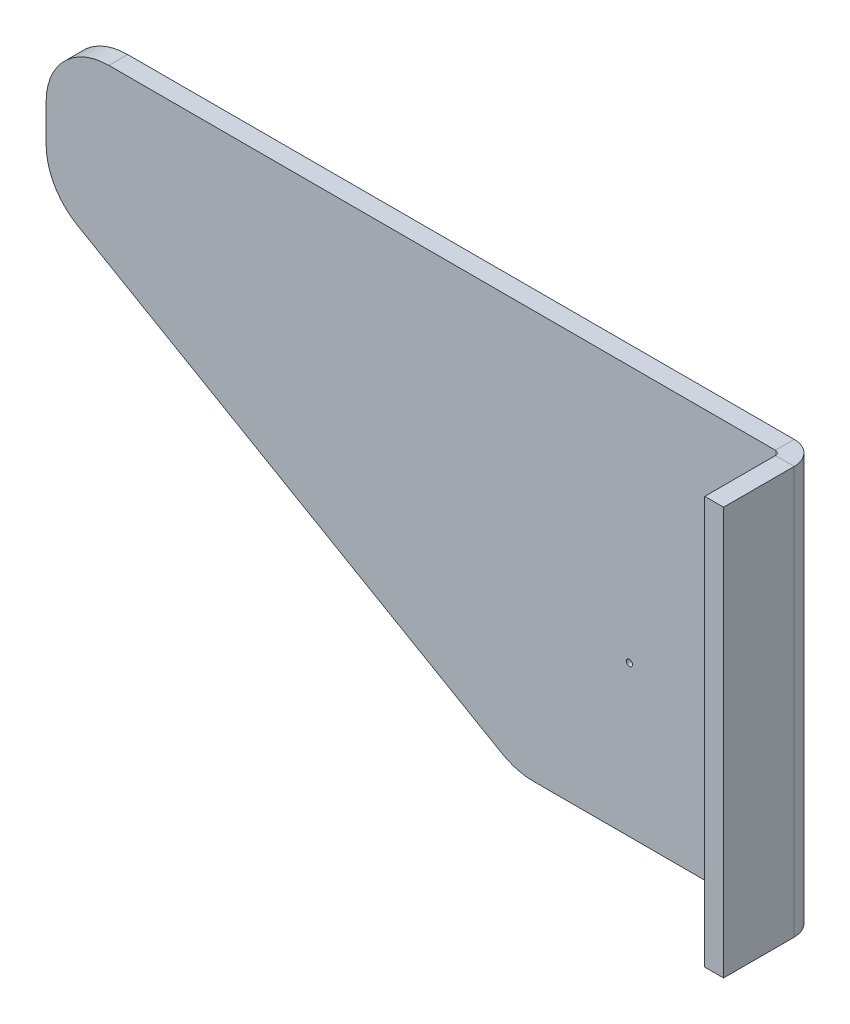
ISO-10303-21;
HEADER;
FILE_DESCRIPTION(('STEP AP214'),'2;1');
FILE_NAME('part.step','',(''),(''),'','','');
FILE_SCHEMA(('AUTOMOTIVE_DESIGN { 1 0 10303 214 1 1 1 1 }'));
ENDSEC;
DATA;
#1=APPLICATION_CONTEXT('core data for automotive mechanical design processes');
#2=APPLICATION_PROTOCOL_DEFINITION('international standard','automotive_design',2000,#1);
#3=PRODUCT_CONTEXT('',#1,'mechanical');
#4=PRODUCT('Part','Part','',(#3));
#5=PRODUCT_RELATED_PRODUCT_CATEGORY('part','',(#4));
#6=PRODUCT_DEFINITION_FORMATION('','',#4);
#7=PRODUCT_DEFINITION_CONTEXT('part definition',#1,'design');
#8=PRODUCT_DEFINITION('design','',#6,#7);
#9=PRODUCT_DEFINITION_SHAPE('','',#8);
#10=(LENGTH_UNIT() NAMED_UNIT(*) SI_UNIT(.MILLI.,.METRE.));
#11=(NAMED_UNIT(*) PLANE_ANGLE_UNIT() SI_UNIT($,.RADIAN.));
#12=(NAMED_UNIT(*) SI_UNIT($,.STERADIAN.) SOLID_ANGLE_UNIT());
#13=UNCERTAINTY_MEASURE_WITH_UNIT(LENGTH_MEASURE(1.E-05),#10,'distance_accuracy_value','');
#14=(GEOMETRIC_REPRESENTATION_CONTEXT(3) GLOBAL_UNCERTAINTY_ASSIGNED_CONTEXT((#13)) GLOBAL_UNIT_ASSIGNED_CONTEXT((#10,
#11,#12)) REPRESENTATION_CONTEXT('',''));
#15=CARTESIAN_POINT('',(0.,0.,0.));
#16=DIRECTION('',(0.,0.,1.));
#17=DIRECTION('',(1.,0.,0.));
#18=AXIS2_PLACEMENT_3D('',#15,#16,#17);
#19=CARTESIAN_POINT('',(0.,0.,-3.));
#20=DIRECTION('',(0.,1.,0.));
#21=DIRECTION('',(0.,0.,1.));
#22=AXIS2_PLACEMENT_3D('',#19,#20,#21);
#23=PLANE('',#22);
#24=DIRECTION('',(-1.,0.,0.));
#25=VECTOR('',#24,1.);
#26=CARTESIAN_POINT('',(0.,0.,-3.));
#27=LINE('',#26,#25);
#28=CARTESIAN_POINT('',(116.2634,0.,-3.));
#29=VERTEX_POINT('',#28);
#30=CARTESIAN_POINT('',(10.,0.,-3.));
#31=VERTEX_POINT('',#30);
#32=EDGE_CURVE('E225',#29,#31,#27,.T.);
#33=ORIENTED_EDGE('',*,*,#32,.T.);
#34=DIRECTION('',(0.,0.,1.));
#35=VECTOR('',#34,1.);
#36=CARTESIAN_POINT('',(10.,0.,-3.));
#37=LINE('',#36,#35);
#38=CARTESIAN_POINT('',(10.,0.,0.));
#39=VERTEX_POINT('',#38);
#40=EDGE_CURVE('E255',#31,#39,#37,.T.);
#41=ORIENTED_EDGE('',*,*,#40,.T.);
#42=DIRECTION('',(-1.,0.,0.));
#43=VECTOR('',#42,1.);
#44=CARTESIAN_POINT('',(0.,0.,0.));
#45=LINE('',#44,#43);
#46=CARTESIAN_POINT('',(116.2634,0.,0.));
#47=VERTEX_POINT('',#46);
#48=EDGE_CURVE('E220',#47,#39,#45,.T.);
#49=ORIENTED_EDGE('',*,*,#48,.F.);
#50=DIRECTION('',(0.,0.,-1.));
#51=VECTOR('',#50,1.);
#52=CARTESIAN_POINT('',(116.2634,0.,0.));
#53=LINE('',#52,#51);
#54=EDGE_CURVE('E199',#47,#29,#53,.T.);
#55=ORIENTED_EDGE('',*,*,#54,.T.);
#56=EDGE_LOOP('',(#33,#41,#49,#55));
#57=FACE_BOUND('',#56,.T.);
#58=ADVANCED_FACE('F60',(#57),#23,.T.);
#59=CARTESIAN_POINT('',(0.,0.,-3.));
#60=DIRECTION('',(0.,0.,-1.));
#61=DIRECTION('',(-1.,0.,0.));
#62=AXIS2_PLACEMENT_3D('',#59,#60,#61);
#63=PLANE('',#62);
#64=CARTESIAN_POINT('',(93.,-41.,-3.00000000000001));
#65=DIRECTION('',(0.,0.,1.));
#66=DIRECTION('',(1.,0.,0.));
#67=AXIS2_PLACEMENT_3D('',#64,#65,#66);
#68=CIRCLE('',#67,0.499999999999999);
#69=CARTESIAN_POINT('',(93.5,-41.,-3.00000000000001));
#70=VERTEX_POINT('',#69);
#71=EDGE_CURVE('E191',#70,#70,#68,.T.);
#72=ORIENTED_EDGE('',*,*,#71,.T.);
#73=EDGE_LOOP('',(#72));
#74=FACE_BOUND('',#73,.T.);
#75=DIRECTION('',(1.,0.,0.));
#76=VECTOR('',#75,1.);
#77=CARTESIAN_POINT('',(120.,-65.,-3.));
#78=LINE('',#77,#76);
#79=CARTESIAN_POINT('',(77.6794919243113,-65.,-3.));
#80=VERTEX_POINT('',#79);
#81=CARTESIAN_POINT('',(116.2634,-65.,-3.));
#82=VERTEX_POINT('',#81);
#83=EDGE_CURVE('E223',#80,#82,#78,.T.);
#84=ORIENTED_EDGE('',*,*,#83,.F.);
#85=CARTESIAN_POINT('',(77.6794919243112,-55.,-3.));
#86=DIRECTION('',(0.,0.,-1.));
#87=DIRECTION('',(-1.,0.,0.));
#88=AXIS2_PLACEMENT_3D('',#85,#86,#87);
#89=CIRCLE('',#88,10.);
#90=CARTESIAN_POINT('',(72.6794919243112,-63.6602540378444,-3.));
#91=VERTEX_POINT('',#90);
#92=EDGE_CURVE('E253',#80,#91,#89,.T.);
#93=ORIENTED_EDGE('',*,*,#92,.T.);
#94=DIRECTION('',(0.866025403784438,-0.500000000000001,0.));
#95=VECTOR('',#94,1.);
#96=CARTESIAN_POINT('',(75.,-65.,-3.));
#97=LINE('',#96,#95);
#98=CARTESIAN_POINT('',(5.,-24.5854811567261,-3.));
#99=VERTEX_POINT('',#98);
#100=EDGE_CURVE('E219',#99,#91,#97,.T.);
#101=ORIENTED_EDGE('',*,*,#100,.F.);
#102=CARTESIAN_POINT('',(10.,-15.9252271188817,-3.));
#103=DIRECTION('',(0.,0.,-1.));
#104=DIRECTION('',(-1.,0.,0.));
#105=AXIS2_PLACEMENT_3D('',#102,#103,#104);
#106=CIRCLE('',#105,10.);
#107=CARTESIAN_POINT('',(0.,-15.9252271188817,-3.));
#108=VERTEX_POINT('',#107);
#109=EDGE_CURVE('E75',#99,#108,#106,.T.);
#110=ORIENTED_EDGE('',*,*,#109,.T.);
#111=DIRECTION('',(0.,-1.,0.));
#112=VECTOR('',#111,1.);
#113=CARTESIAN_POINT('',(0.,-21.698729810778,-3.));
#114=LINE('',#113,#112);
#115=CARTESIAN_POINT('',(0.,-10.,-3.));
#116=VERTEX_POINT('',#115);
#117=EDGE_CURVE('E217',#116,#108,#114,.T.);
#118=ORIENTED_EDGE('',*,*,#117,.F.);
#119=CARTESIAN_POINT('',(10.,-10.,-3.));
#120=DIRECTION('',(0.,0.,-1.));
#121=DIRECTION('',(-1.,0.,0.));
#122=AXIS2_PLACEMENT_3D('',#119,#120,#121);
#123=CIRCLE('',#122,10.);
#124=EDGE_CURVE('E251',#116,#31,#123,.T.);
#125=ORIENTED_EDGE('',*,*,#124,.T.);
#126=ORIENTED_EDGE('',*,*,#32,.F.);
#127=DIRECTION('',(0.,1.,0.));
#128=VECTOR('',#127,1.);
#129=CARTESIAN_POINT('',(116.2634,0.,-3.));
#130=LINE('',#129,#128);
#131=EDGE_CURVE('E192',#29,#82,#130,.F.);
#132=ORIENTED_EDGE('',*,*,#131,.T.);
#133=EDGE_LOOP('',(#84,#93,#101,#110,#118,#125,#126,#132));
#134=FACE_BOUND('',#133,.T.);
#135=ADVANCED_FACE('F273',(#74,#134),#63,.T.);
#136=CARTESIAN_POINT('',(0.,0.,0.));
#137=DIRECTION('',(0.,0.,-1.));
#138=DIRECTION('',(-1.,0.,0.));
#139=AXIS2_PLACEMENT_3D('',#136,#137,#138);
#140=PLANE('',#139);
#141=CARTESIAN_POINT('',(93.,-41.,0.));
#142=DIRECTION('',(0.,0.,1.));
#143=DIRECTION('',(1.,0.,0.));
#144=AXIS2_PLACEMENT_3D('',#141,#142,#143);
#145=CIRCLE('',#144,0.499999999999999);
#146=CARTESIAN_POINT('',(93.5,-41.,0.));
#147=VERTEX_POINT('',#146);
#148=EDGE_CURVE('E286',#147,#147,#145,.T.);
#149=ORIENTED_EDGE('',*,*,#148,.F.);
#150=EDGE_LOOP('',(#149));
#151=FACE_BOUND('',#150,.T.);
#152=DIRECTION('',(0.866025403784438,-0.500000000000001,0.));
#153=VECTOR('',#152,1.);
#154=CARTESIAN_POINT('',(75.,-65.,0.));
#155=LINE('',#154,#153);
#156=CARTESIAN_POINT('',(5.,-24.5854811567261,0.));
#157=VERTEX_POINT('',#156);
#158=CARTESIAN_POINT('',(72.6794919243112,-63.6602540378444,0.));
#159=VERTEX_POINT('',#158);
#160=EDGE_CURVE('E231',#157,#159,#155,.T.);
#161=ORIENTED_EDGE('',*,*,#160,.T.);
#162=CARTESIAN_POINT('',(77.6794919243112,-55.,0.));
#163=DIRECTION('',(0.,0.,-1.));
#164=DIRECTION('',(-1.,0.,0.));
#165=AXIS2_PLACEMENT_3D('',#162,#163,#164);
#166=CIRCLE('',#165,10.);
#167=CARTESIAN_POINT('',(77.6794919243113,-65.,0.));
#168=VERTEX_POINT('',#167);
#169=EDGE_CURVE('E246',#159,#168,#166,.F.);
#170=ORIENTED_EDGE('',*,*,#169,.T.);
#171=DIRECTION('',(1.,0.,0.));
#172=VECTOR('',#171,1.);
#173=CARTESIAN_POINT('',(120.,-65.,0.));
#174=LINE('',#173,#172);
#175=CARTESIAN_POINT('',(116.2634,-65.,0.));
#176=VERTEX_POINT('',#175);
#177=EDGE_CURVE('E234',#168,#176,#174,.T.);
#178=ORIENTED_EDGE('',*,*,#177,.T.);
#179=DIRECTION('',(0.,1.,0.));
#180=VECTOR('',#179,1.);
#181=CARTESIAN_POINT('',(116.2634,0.,0.));
#182=LINE('',#181,#180);
#183=EDGE_CURVE('E205',#47,#176,#182,.F.);
#184=ORIENTED_EDGE('',*,*,#183,.F.);
#185=ORIENTED_EDGE('',*,*,#48,.T.);
#186=CARTESIAN_POINT('',(10.,-10.,0.));
#187=DIRECTION('',(0.,0.,-1.));
#188=DIRECTION('',(-1.,0.,0.));
#189=AXIS2_PLACEMENT_3D('',#186,#187,#188);
#190=CIRCLE('',#189,10.);
#191=CARTESIAN_POINT('',(0.,-10.,0.));
#192=VERTEX_POINT('',#191);
#193=EDGE_CURVE('E244',#39,#192,#190,.F.);
#194=ORIENTED_EDGE('',*,*,#193,.T.);
#195=DIRECTION('',(0.,-1.,0.));
#196=VECTOR('',#195,1.);
#197=CARTESIAN_POINT('',(0.,-21.698729810778,0.));
#198=LINE('',#197,#196);
#199=CARTESIAN_POINT('',(0.,-15.9252271188817,0.));
#200=VERTEX_POINT('',#199);
#201=EDGE_CURVE('E214',#192,#200,#198,.T.);
#202=ORIENTED_EDGE('',*,*,#201,.T.);
#203=CARTESIAN_POINT('',(10.,-15.9252271188817,0.));
#204=DIRECTION('',(0.,0.,-1.));
#205=DIRECTION('',(-1.,0.,0.));
#206=AXIS2_PLACEMENT_3D('',#203,#204,#205);
#207=CIRCLE('',#206,10.);
#208=EDGE_CURVE('E242',#200,#157,#207,.F.);
#209=ORIENTED_EDGE('',*,*,#208,.T.);
#210=EDGE_LOOP('',(#161,#170,#178,#184,#185,#194,#202,#209));
#211=FACE_BOUND('',#210,.T.);
#212=ADVANCED_FACE('F262',(#151,#211),#140,.F.);
#213=CARTESIAN_POINT('',(0.,-21.698729810778,-3.));
#214=DIRECTION('',(-1.,0.,0.));
#215=DIRECTION('',(0.,0.,1.));
#216=AXIS2_PLACEMENT_3D('',#213,#214,#215);
#217=PLANE('',#216);
#218=ORIENTED_EDGE('',*,*,#201,.F.);
#219=DIRECTION('',(0.,0.,1.));
#220=VECTOR('',#219,1.);
#221=CARTESIAN_POINT('',(0.,-10.,-3.));
#222=LINE('',#221,#220);
#223=EDGE_CURVE('E13',#192,#116,#222,.F.);
#224=ORIENTED_EDGE('',*,*,#223,.T.);
#225=ORIENTED_EDGE('',*,*,#117,.T.);
#226=DIRECTION('',(0.,0.,1.));
#227=VECTOR('',#226,1.);
#228=CARTESIAN_POINT('',(0.,-15.9252271188817,-3.));
#229=LINE('',#228,#227);
#230=EDGE_CURVE('E68',#108,#200,#229,.T.);
#231=ORIENTED_EDGE('',*,*,#230,.T.);
#232=EDGE_LOOP('',(#218,#224,#225,#231));
#233=FACE_BOUND('',#232,.T.);
#234=ADVANCED_FACE('F259',(#233),#217,.T.);
#235=CARTESIAN_POINT('',(120.,-65.,-3.));
#236=DIRECTION('',(0.,-1.,0.));
#237=DIRECTION('',(0.,0.,-1.));
#238=AXIS2_PLACEMENT_3D('',#235,#236,#237);
#239=PLANE('',#238);
#240=ORIENTED_EDGE('',*,*,#177,.F.);
#241=DIRECTION('',(0.,0.,1.));
#242=VECTOR('',#241,1.);
#243=CARTESIAN_POINT('',(77.6794919243112,-65.,-3.));
#244=LINE('',#243,#242);
#245=EDGE_CURVE('E248',#168,#80,#244,.F.);
#246=ORIENTED_EDGE('',*,*,#245,.T.);
#247=ORIENTED_EDGE('',*,*,#83,.T.);
#248=DIRECTION('',(0.,0.,-1.));
#249=VECTOR('',#248,1.);
#250=CARTESIAN_POINT('',(116.2634,-65.,0.));
#251=LINE('',#250,#249);
#252=EDGE_CURVE('E211',#176,#82,#251,.T.);
#253=ORIENTED_EDGE('',*,*,#252,.F.);
#254=EDGE_LOOP('',(#240,#246,#247,#253));
#255=FACE_BOUND('',#254,.T.);
#256=ADVANCED_FACE('F306',(#255),#239,.T.);
#257=CARTESIAN_POINT('',(75.,-65.,-3.));
#258=DIRECTION('',(-0.500000000000001,-0.866025403784438,0.));
#259=DIRECTION('',(0.866025403784438,-0.500000000000001,0.));
#260=AXIS2_PLACEMENT_3D('',#257,#258,#259);
#261=PLANE('',#260);
#262=ORIENTED_EDGE('',*,*,#100,.T.);
#263=DIRECTION('',(0.,0.,1.));
#264=VECTOR('',#263,1.);
#265=CARTESIAN_POINT('',(72.6794919243112,-63.6602540378444,-3.));
#266=LINE('',#265,#264);
#267=EDGE_CURVE('E239',#91,#159,#266,.T.);
#268=ORIENTED_EDGE('',*,*,#267,.T.);
#269=ORIENTED_EDGE('',*,*,#160,.F.);
#270=DIRECTION('',(0.,0.,1.));
#271=VECTOR('',#270,1.);
#272=CARTESIAN_POINT('',(4.99999999999999,-24.5854811567261,-3.));
#273=LINE('',#272,#271);
#274=EDGE_CURVE('E228',#157,#99,#273,.F.);
#275=ORIENTED_EDGE('',*,*,#274,.T.);
#276=EDGE_LOOP('',(#262,#268,#269,#275));
#277=FACE_BOUND('',#276,.T.);
#278=ADVANCED_FACE('F317',(#277),#261,.T.);
#279=CARTESIAN_POINT('',(116.2634,-65.,0.736600000000006));
#280=DIRECTION('',(0.,-1.,0.));
#281=DIRECTION('',(0.,0.,-1.));
#282=AXIS2_PLACEMENT_3D('',#279,#280,#281);
#283=PLANE('',#282);
#284=DIRECTION('',(-1.,0.,0.));
#285=VECTOR('',#284,1.);
#286=CARTESIAN_POINT('',(120.,-65.,0.736599999999993));
#287=LINE('',#286,#285);
#288=CARTESIAN_POINT('',(117.,-65.,0.736600000000004));
#289=VERTEX_POINT('',#288);
#290=CARTESIAN_POINT('',(120.,-65.,0.736599999999993));
#291=VERTEX_POINT('',#290);
#292=EDGE_CURVE('E173',#289,#291,#287,.F.);
#293=ORIENTED_EDGE('',*,*,#292,.F.);
#294=CARTESIAN_POINT('',(116.2634,-65.,0.736600000000006));
#295=DIRECTION('',(0.,1.,0.));
#296=DIRECTION('',(0.,0.,1.));
#297=AXIS2_PLACEMENT_3D('',#294,#295,#296);
#298=CIRCLE('',#297,0.736600000000018);
#299=EDGE_CURVE('E202',#176,#289,#298,.F.);
#300=ORIENTED_EDGE('',*,*,#299,.F.);
#301=ORIENTED_EDGE('',*,*,#252,.T.);
#302=CARTESIAN_POINT('',(116.2634,-65.,0.736600000000006));
#303=DIRECTION('',(0.,1.,0.));
#304=DIRECTION('',(0.,0.,1.));
#305=AXIS2_PLACEMENT_3D('',#302,#303,#304);
#306=CIRCLE('',#305,3.73660000000002);
#307=EDGE_CURVE('E195',#82,#291,#306,.F.);
#308=ORIENTED_EDGE('',*,*,#307,.T.);
#309=EDGE_LOOP('',(#293,#300,#301,#308));
#310=FACE_BOUND('',#309,.T.);
#311=ADVANCED_FACE('F320',(#310),#283,.T.);
#312=CARTESIAN_POINT('',(116.2634,0.,0.736600000000021));
#313=DIRECTION('',(0.,-1.,0.));
#314=DIRECTION('',(0.,0.,-1.));
#315=AXIS2_PLACEMENT_3D('',#312,#313,#314);
#316=PLANE('',#315);
#317=CARTESIAN_POINT('',(116.2634,0.,0.736600000000021));
#318=DIRECTION('',(0.,1.,0.));
#319=DIRECTION('',(0.,0.,1.));
#320=AXIS2_PLACEMENT_3D('',#317,#318,#319);
#321=CIRCLE('',#320,0.736600000000018);
#322=CARTESIAN_POINT('',(117.,0.,0.736600000000018));
#323=VERTEX_POINT('',#322);
#324=EDGE_CURVE('E208',#323,#47,#321,.T.);
#325=ORIENTED_EDGE('',*,*,#324,.F.);
#326=DIRECTION('',(-1.,0.,0.));
#327=VECTOR('',#326,1.);
#328=CARTESIAN_POINT('',(117.,0.,0.736600000000018));
#329=LINE('',#328,#327);
#330=CARTESIAN_POINT('',(120.,0.,0.736600000000007));
#331=VERTEX_POINT('',#330);
#332=EDGE_CURVE('E185',#323,#331,#329,.F.);
#333=ORIENTED_EDGE('',*,*,#332,.T.);
#334=CARTESIAN_POINT('',(116.2634,0.,0.736600000000021));
#335=DIRECTION('',(0.,1.,0.));
#336=DIRECTION('',(0.,0.,1.));
#337=AXIS2_PLACEMENT_3D('',#334,#335,#336);
#338=CIRCLE('',#337,3.73660000000002);
#339=EDGE_CURVE('E196',#331,#29,#338,.T.);
#340=ORIENTED_EDGE('',*,*,#339,.T.);
#341=ORIENTED_EDGE('',*,*,#54,.F.);
#342=EDGE_LOOP('',(#325,#333,#340,#341));
#343=FACE_BOUND('',#342,.T.);
#344=ADVANCED_FACE('F280',(#343),#316,.F.);
#345=CARTESIAN_POINT('',(116.2634,0.,0.736600000000021));
#346=DIRECTION('',(0.,1.,0.));
#347=DIRECTION('',(1.,0.,0.));
#348=AXIS2_PLACEMENT_3D('',#345,#346,#347);
#349=CYLINDRICAL_SURFACE('',#348,3.73660000000002);
#350=ORIENTED_EDGE('',*,*,#131,.F.);
#351=ORIENTED_EDGE('',*,*,#339,.F.);
#352=DIRECTION('',(0.,1.,0.));
#353=VECTOR('',#352,1.);
#354=CARTESIAN_POINT('',(120.,-65.,0.736599999999993));
#355=LINE('',#354,#353);
#356=EDGE_CURVE('E183',#331,#291,#355,.F.);
#357=ORIENTED_EDGE('',*,*,#356,.T.);
#358=ORIENTED_EDGE('',*,*,#307,.F.);
#359=EDGE_LOOP('',(#350,#351,#357,#358));
#360=FACE_BOUND('',#359,.T.);
#361=ADVANCED_FACE('F277',(#360),#349,.T.);
#362=CARTESIAN_POINT('',(116.2634,0.,0.736600000000021));
#363=DIRECTION('',(0.,1.,0.));
#364=DIRECTION('',(1.,0.,0.));
#365=AXIS2_PLACEMENT_3D('',#362,#363,#364);
#366=CYLINDRICAL_SURFACE('',#365,0.736600000000018);
#367=ORIENTED_EDGE('',*,*,#183,.T.);
#368=ORIENTED_EDGE('',*,*,#299,.T.);
#369=DIRECTION('',(0.,1.,0.));
#370=VECTOR('',#369,1.);
#371=CARTESIAN_POINT('',(117.,-65.,0.736600000000004));
#372=LINE('',#371,#370);
#373=EDGE_CURVE('E188',#289,#323,#372,.T.);
#374=ORIENTED_EDGE('',*,*,#373,.T.);
#375=ORIENTED_EDGE('',*,*,#324,.T.);
#376=EDGE_LOOP('',(#367,#368,#374,#375));
#377=FACE_BOUND('',#376,.T.);
#378=ADVANCED_FACE('F341',(#377),#366,.F.);
#379=CARTESIAN_POINT('',(120.,0.,12.));
#380=DIRECTION('',(0.,-1.,0.));
#381=DIRECTION('',(1.,0.,0.));
#382=AXIS2_PLACEMENT_3D('',#379,#380,#381);
#383=PLANE('',#382);
#384=ORIENTED_EDGE('',*,*,#332,.F.);
#385=DIRECTION('',(0.,0.,-1.));
#386=VECTOR('',#385,1.);
#387=CARTESIAN_POINT('',(117.,0.,12.));
#388=LINE('',#387,#386);
#389=CARTESIAN_POINT('',(117.,0.,12.));
#390=VERTEX_POINT('',#389);
#391=EDGE_CURVE('E181',#323,#390,#388,.F.);
#392=ORIENTED_EDGE('',*,*,#391,.T.);
#393=DIRECTION('',(-1.,0.,0.));
#394=VECTOR('',#393,1.);
#395=CARTESIAN_POINT('',(120.,0.,12.));
#396=LINE('',#395,#394);
#397=CARTESIAN_POINT('',(120.,0.,12.));
#398=VERTEX_POINT('',#397);
#399=EDGE_CURVE('E169',#398,#390,#396,.T.);
#400=ORIENTED_EDGE('',*,*,#399,.F.);
#401=DIRECTION('',(0.,0.,1.));
#402=VECTOR('',#401,1.);
#403=CARTESIAN_POINT('',(120.,0.,-4.26808078250963E-13));
#404=LINE('',#403,#402);
#405=EDGE_CURVE('E156',#331,#398,#404,.T.);
#406=ORIENTED_EDGE('',*,*,#405,.F.);
#407=EDGE_LOOP('',(#384,#392,#400,#406));
#408=FACE_BOUND('',#407,.T.);
#409=ADVANCED_FACE('F284',(#408),#383,.F.);
#410=CARTESIAN_POINT('',(120.,-65.,0.));
#411=DIRECTION('',(0.,1.,0.));
#412=DIRECTION('',(-1.,0.,0.));
#413=AXIS2_PLACEMENT_3D('',#410,#411,#412);
#414=PLANE('',#413);
#415=ORIENTED_EDGE('',*,*,#292,.T.);
#416=DIRECTION('',(0.,0.,-1.));
#417=VECTOR('',#416,1.);
#418=CARTESIAN_POINT('',(120.,-65.,-4.26808078250963E-13));
#419=LINE('',#418,#417);
#420=CARTESIAN_POINT('',(120.,-65.,12.));
#421=VERTEX_POINT('',#420);
#422=EDGE_CURVE('E154',#421,#291,#419,.T.);
#423=ORIENTED_EDGE('',*,*,#422,.F.);
#424=DIRECTION('',(-1.,0.,0.));
#425=VECTOR('',#424,1.);
#426=CARTESIAN_POINT('',(120.,-65.,12.));
#427=LINE('',#426,#425);
#428=CARTESIAN_POINT('',(117.,-65.,12.));
#429=VERTEX_POINT('',#428);
#430=EDGE_CURVE('E162',#421,#429,#427,.T.);
#431=ORIENTED_EDGE('',*,*,#430,.T.);
#432=DIRECTION('',(0.,0.,1.));
#433=VECTOR('',#432,1.);
#434=CARTESIAN_POINT('',(117.,-65.,0.));
#435=LINE('',#434,#433);
#436=EDGE_CURVE('E178',#429,#289,#435,.F.);
#437=ORIENTED_EDGE('',*,*,#436,.T.);
#438=EDGE_LOOP('',(#415,#423,#431,#437));
#439=FACE_BOUND('',#438,.T.);
#440=ADVANCED_FACE('F172',(#439),#414,.F.);
#441=CARTESIAN_POINT('',(120.,0.,-4.26808078250963E-13));
#442=DIRECTION('',(-1.,0.,0.));
#443=DIRECTION('',(0.,0.,1.));
#444=AXIS2_PLACEMENT_3D('',#441,#442,#443);
#445=PLANE('',#444);
#446=ORIENTED_EDGE('',*,*,#356,.F.);
#447=ORIENTED_EDGE('',*,*,#405,.T.);
#448=DIRECTION('',(0.,-1.,0.));
#449=VECTOR('',#448,1.);
#450=CARTESIAN_POINT('',(120.,0.,12.));
#451=LINE('',#450,#449);
#452=EDGE_CURVE('E149',#398,#421,#451,.T.);
#453=ORIENTED_EDGE('',*,*,#452,.T.);
#454=ORIENTED_EDGE('',*,*,#422,.T.);
#455=EDGE_LOOP('',(#446,#447,#453,#454));
#456=FACE_BOUND('',#455,.T.);
#457=ADVANCED_FACE('F152',(#456),#445,.F.);
#458=CARTESIAN_POINT('',(117.,0.,-4.16333634234433E-13));
#459=DIRECTION('',(-1.,0.,0.));
#460=DIRECTION('',(0.,0.,1.));
#461=AXIS2_PLACEMENT_3D('',#458,#459,#460);
#462=PLANE('',#461);
#463=ORIENTED_EDGE('',*,*,#391,.F.);
#464=ORIENTED_EDGE('',*,*,#373,.F.);
#465=ORIENTED_EDGE('',*,*,#436,.F.);
#466=DIRECTION('',(0.,1.,0.));
#467=VECTOR('',#466,1.);
#468=CARTESIAN_POINT('',(117.,-65.,12.));
#469=LINE('',#468,#467);
#470=EDGE_CURVE('E165',#390,#429,#469,.F.);
#471=ORIENTED_EDGE('',*,*,#470,.F.);
#472=EDGE_LOOP('',(#463,#464,#465,#471));
#473=FACE_BOUND('',#472,.T.);
#474=ADVANCED_FACE('F343',(#473),#462,.T.);
#475=CARTESIAN_POINT('',(120.,-65.,12.));
#476=DIRECTION('',(0.,0.,-1.));
#477=DIRECTION('',(-1.,0.,0.));
#478=AXIS2_PLACEMENT_3D('',#475,#476,#477);
#479=PLANE('',#478);
#480=ORIENTED_EDGE('',*,*,#470,.T.);
#481=ORIENTED_EDGE('',*,*,#430,.F.);
#482=ORIENTED_EDGE('',*,*,#452,.F.);
#483=ORIENTED_EDGE('',*,*,#399,.T.);
#484=EDGE_LOOP('',(#480,#481,#482,#483));
#485=FACE_BOUND('',#484,.T.);
#486=ADVANCED_FACE('F163',(#485),#479,.F.);
#487=CARTESIAN_POINT('',(77.6794919243112,-55.,-3.));
#488=DIRECTION('',(0.,0.,1.));
#489=DIRECTION('',(1.,0.,0.));
#490=AXIS2_PLACEMENT_3D('',#487,#488,#489);
#491=CYLINDRICAL_SURFACE('',#490,10.);
#492=ORIENTED_EDGE('',*,*,#92,.F.);
#493=ORIENTED_EDGE('',*,*,#245,.F.);
#494=ORIENTED_EDGE('',*,*,#169,.F.);
#495=ORIENTED_EDGE('',*,*,#267,.F.);
#496=EDGE_LOOP('',(#492,#493,#494,#495));
#497=FACE_BOUND('',#496,.T.);
#498=ADVANCED_FACE('F323',(#497),#491,.T.);
#499=CARTESIAN_POINT('',(10.,-10.,-3.));
#500=DIRECTION('',(0.,0.,1.));
#501=DIRECTION('',(1.,0.,0.));
#502=AXIS2_PLACEMENT_3D('',#499,#500,#501);
#503=CYLINDRICAL_SURFACE('',#502,10.);
#504=ORIENTED_EDGE('',*,*,#124,.F.);
#505=ORIENTED_EDGE('',*,*,#223,.F.);
#506=ORIENTED_EDGE('',*,*,#193,.F.);
#507=ORIENTED_EDGE('',*,*,#40,.F.);
#508=EDGE_LOOP('',(#504,#505,#506,#507));
#509=FACE_BOUND('',#508,.T.);
#510=ADVANCED_FACE('F269',(#509),#503,.T.);
#511=CARTESIAN_POINT('',(10.,-15.9252271188817,-3.));
#512=DIRECTION('',(0.,0.,1.));
#513=DIRECTION('',(1.,0.,0.));
#514=AXIS2_PLACEMENT_3D('',#511,#512,#513);
#515=CYLINDRICAL_SURFACE('',#514,10.);
#516=ORIENTED_EDGE('',*,*,#109,.F.);
#517=ORIENTED_EDGE('',*,*,#274,.F.);
#518=ORIENTED_EDGE('',*,*,#208,.F.);
#519=ORIENTED_EDGE('',*,*,#230,.F.);
#520=EDGE_LOOP('',(#516,#517,#518,#519));
#521=FACE_BOUND('',#520,.T.);
#522=ADVANCED_FACE('F62',(#521),#515,.T.);
#523=CARTESIAN_POINT('',(93.,-41.,-3.00000000000001));
#524=DIRECTION('',(0.,0.,1.));
#525=DIRECTION('',(1.,0.,0.));
#526=AXIS2_PLACEMENT_3D('',#523,#524,#525);
#527=CYLINDRICAL_SURFACE('',#526,0.499999999999999);
#528=ORIENTED_EDGE('',*,*,#71,.F.);
#529=EDGE_LOOP('',(#528));
#530=FACE_BOUND('',#529,.T.);
#531=ORIENTED_EDGE('',*,*,#148,.T.);
#532=EDGE_LOOP('',(#531));
#533=FACE_BOUND('',#532,.T.);
#534=ADVANCED_FACE('F293',(#530,#533),#527,.F.);
#535=CLOSED_SHELL('',(#58,#135,#212,#234,#256,#278,#311,#344,#361,#378,#409,#440,#457,#474,#486,
#498,#510,#522,#534));
#536=MANIFOLD_SOLID_BREP('B2',#535);
#537=ADVANCED_BREP_SHAPE_REPRESENTATION('',(#18,#536),#14);
#538=SHAPE_DEFINITION_REPRESENTATION(#9,#537);
ENDSEC;
END-ISO-10303-21;
